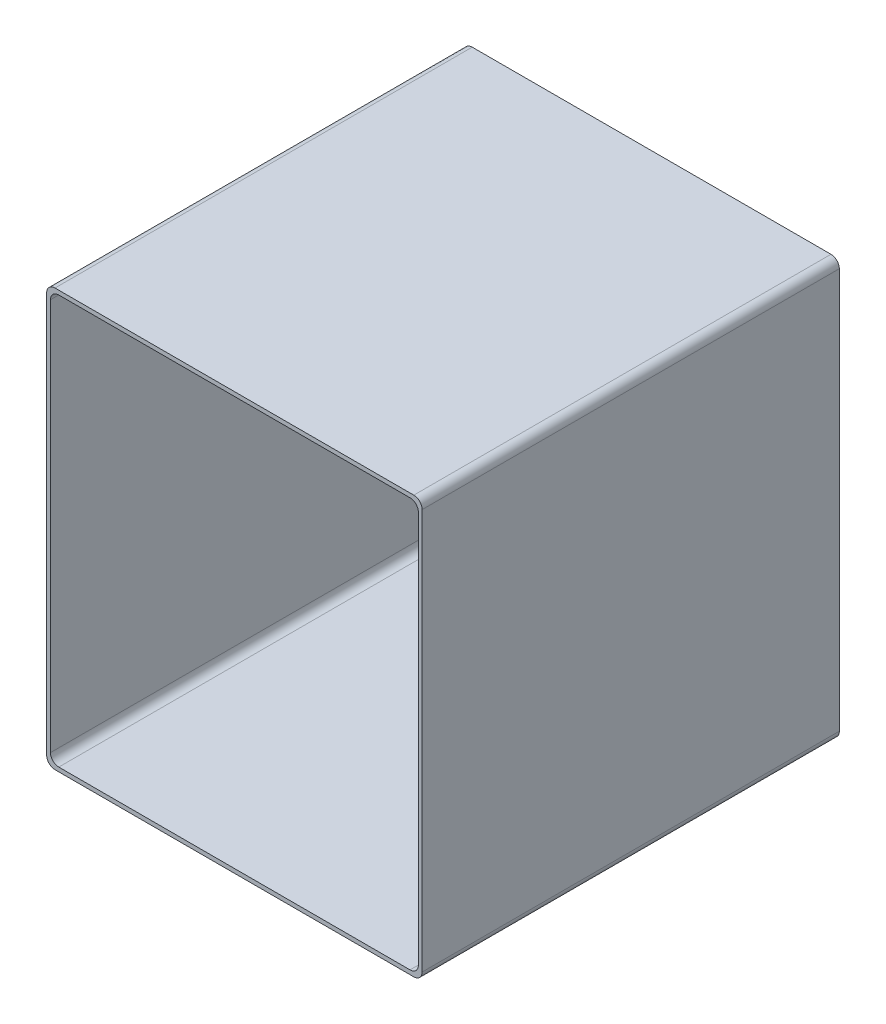
ISO-10303-21;
HEADER;
FILE_DESCRIPTION(('STEP AP214'),'2;1');
FILE_NAME('part.step','',(''),(''),'','','');
FILE_SCHEMA(('AUTOMOTIVE_DESIGN { 1 0 10303 214 1 1 1 1 }'));
ENDSEC;
DATA;
#1=APPLICATION_CONTEXT('core data for automotive mechanical design processes');
#2=APPLICATION_PROTOCOL_DEFINITION('international standard','automotive_design',2000,#1);
#3=PRODUCT_CONTEXT('',#1,'mechanical');
#4=PRODUCT('Part','Part','',(#3));
#5=PRODUCT_RELATED_PRODUCT_CATEGORY('part','',(#4));
#6=PRODUCT_DEFINITION_FORMATION('','',#4);
#7=PRODUCT_DEFINITION_CONTEXT('part definition',#1,'design');
#8=PRODUCT_DEFINITION('design','',#6,#7);
#9=PRODUCT_DEFINITION_SHAPE('','',#8);
#10=(LENGTH_UNIT() NAMED_UNIT(*) SI_UNIT(.MILLI.,.METRE.));
#11=(NAMED_UNIT(*) PLANE_ANGLE_UNIT() SI_UNIT($,.RADIAN.));
#12=(NAMED_UNIT(*) SI_UNIT($,.STERADIAN.) SOLID_ANGLE_UNIT());
#13=UNCERTAINTY_MEASURE_WITH_UNIT(LENGTH_MEASURE(1.E-05),#10,'distance_accuracy_value','');
#14=(GEOMETRIC_REPRESENTATION_CONTEXT(3) GLOBAL_UNCERTAINTY_ASSIGNED_CONTEXT((#13)) GLOBAL_UNIT_ASSIGNED_CONTEXT((#10,
#11,#12)) REPRESENTATION_CONTEXT('',''));
#15=CARTESIAN_POINT('',(0.,0.,0.));
#16=DIRECTION('',(0.,0.,1.));
#17=DIRECTION('',(1.,0.,0.));
#18=AXIS2_PLACEMENT_3D('',#15,#16,#17);
#19=CARTESIAN_POINT('',(0.,0.,500.));
#20=DIRECTION('',(0.,0.,-1.));
#21=DIRECTION('',(-1.,0.,0.));
#22=AXIS2_PLACEMENT_3D('',#19,#20,#21);
#23=PLANE('',#22);
#24=DIRECTION('',(0.,-1.,0.));
#25=VECTOR('',#24,1.);
#26=CARTESIAN_POINT('',(0.,0.,500.));
#27=LINE('',#26,#25);
#28=CARTESIAN_POINT('',(0.,490.,500.));
#29=VERTEX_POINT('',#28);
#30=CARTESIAN_POINT('',(0.,10.,500.));
#31=VERTEX_POINT('',#30);
#32=EDGE_CURVE('E266',#29,#31,#27,.T.);
#33=ORIENTED_EDGE('',*,*,#32,.T.);
#34=CARTESIAN_POINT('',(10.,10.,500.));
#35=DIRECTION('',(0.,0.,-1.));
#36=DIRECTION('',(-1.,0.,0.));
#37=AXIS2_PLACEMENT_3D('',#34,#35,#36);
#38=CIRCLE('',#37,10.);
#39=CARTESIAN_POINT('',(10.,0.,500.));
#40=VERTEX_POINT('',#39);
#41=EDGE_CURVE('E216',#31,#40,#38,.F.);
#42=ORIENTED_EDGE('',*,*,#41,.T.);
#43=DIRECTION('',(1.,0.,0.));
#44=VECTOR('',#43,1.);
#45=CARTESIAN_POINT('',(0.,0.,500.));
#46=LINE('',#45,#44);
#47=CARTESIAN_POINT('',(440.,0.,500.));
#48=VERTEX_POINT('',#47);
#49=EDGE_CURVE('E269',#40,#48,#46,.T.);
#50=ORIENTED_EDGE('',*,*,#49,.T.);
#51=CARTESIAN_POINT('',(440.,10.,500.));
#52=DIRECTION('',(0.,0.,-1.));
#53=DIRECTION('',(-1.,0.,0.));
#54=AXIS2_PLACEMENT_3D('',#51,#52,#53);
#55=CIRCLE('',#54,10.);
#56=CARTESIAN_POINT('',(450.,10.,500.));
#57=VERTEX_POINT('',#56);
#58=EDGE_CURVE('E212',#48,#57,#55,.F.);
#59=ORIENTED_EDGE('',*,*,#58,.T.);
#60=DIRECTION('',(0.,1.,0.));
#61=VECTOR('',#60,1.);
#62=CARTESIAN_POINT('',(450.,0.,500.));
#63=LINE('',#62,#61);
#64=CARTESIAN_POINT('',(450.,490.,500.));
#65=VERTEX_POINT('',#64);
#66=EDGE_CURVE('E174',#57,#65,#63,.T.);
#67=ORIENTED_EDGE('',*,*,#66,.T.);
#68=CARTESIAN_POINT('',(440.,490.,500.));
#69=DIRECTION('',(0.,0.,-1.));
#70=DIRECTION('',(-1.,0.,0.));
#71=AXIS2_PLACEMENT_3D('',#68,#69,#70);
#72=CIRCLE('',#71,10.);
#73=CARTESIAN_POINT('',(440.,500.,500.));
#74=VERTEX_POINT('',#73);
#75=EDGE_CURVE('E55',#65,#74,#72,.F.);
#76=ORIENTED_EDGE('',*,*,#75,.T.);
#77=DIRECTION('',(-1.,0.,0.));
#78=VECTOR('',#77,1.);
#79=CARTESIAN_POINT('',(0.,500.,500.));
#80=LINE('',#79,#78);
#81=CARTESIAN_POINT('',(9.99999999999995,500.,500.));
#82=VERTEX_POINT('',#81);
#83=EDGE_CURVE('E170',#74,#82,#80,.T.);
#84=ORIENTED_EDGE('',*,*,#83,.T.);
#85=CARTESIAN_POINT('',(9.99999999999995,490.,500.));
#86=DIRECTION('',(0.,0.,-1.));
#87=DIRECTION('',(-1.,0.,0.));
#88=AXIS2_PLACEMENT_3D('',#85,#86,#87);
#89=CIRCLE('',#88,10.);
#90=EDGE_CURVE('E214',#82,#29,#89,.F.);
#91=ORIENTED_EDGE('',*,*,#90,.T.);
#92=EDGE_LOOP('',(#33,#42,#50,#59,#67,#76,#84,#91));
#93=FACE_BOUND('',#92,.T.);
#94=DIRECTION('',(0.,-1.,0.));
#95=VECTOR('',#94,1.);
#96=CARTESIAN_POINT('',(4.5,5.,500.));
#97=LINE('',#96,#95);
#98=CARTESIAN_POINT('',(4.5,485.,500.));
#99=VERTEX_POINT('',#98);
#100=CARTESIAN_POINT('',(4.5,15.,500.));
#101=VERTEX_POINT('',#100);
#102=EDGE_CURVE('E245',#99,#101,#97,.T.);
#103=ORIENTED_EDGE('',*,*,#102,.F.);
#104=CARTESIAN_POINT('',(14.5,485.,500.));
#105=DIRECTION('',(0.,0.,-1.));
#106=DIRECTION('',(-1.,0.,0.));
#107=AXIS2_PLACEMENT_3D('',#104,#105,#106);
#108=CIRCLE('',#107,10.);
#109=CARTESIAN_POINT('',(14.5,495.,500.));
#110=VERTEX_POINT('',#109);
#111=EDGE_CURVE('E157',#99,#110,#108,.T.);
#112=ORIENTED_EDGE('',*,*,#111,.T.);
#113=DIRECTION('',(-1.,0.,0.));
#114=VECTOR('',#113,1.);
#115=CARTESIAN_POINT('',(4.5,495.,500.));
#116=LINE('',#115,#114);
#117=CARTESIAN_POINT('',(435.5,495.,500.));
#118=VERTEX_POINT('',#117);
#119=EDGE_CURVE('E242',#118,#110,#116,.T.);
#120=ORIENTED_EDGE('',*,*,#119,.F.);
#121=CARTESIAN_POINT('',(435.5,485.,500.));
#122=DIRECTION('',(0.,0.,-1.));
#123=DIRECTION('',(-1.,0.,0.));
#124=AXIS2_PLACEMENT_3D('',#121,#122,#123);
#125=CIRCLE('',#124,10.);
#126=CARTESIAN_POINT('',(445.5,485.,500.));
#127=VERTEX_POINT('',#126);
#128=EDGE_CURVE('E233',#118,#127,#125,.T.);
#129=ORIENTED_EDGE('',*,*,#128,.T.);
#130=DIRECTION('',(0.,1.,0.));
#131=VECTOR('',#130,1.);
#132=CARTESIAN_POINT('',(445.5,5.,500.));
#133=LINE('',#132,#131);
#134=CARTESIAN_POINT('',(445.5,15.,500.));
#135=VERTEX_POINT('',#134);
#136=EDGE_CURVE('E255',#135,#127,#133,.T.);
#137=ORIENTED_EDGE('',*,*,#136,.F.);
#138=CARTESIAN_POINT('',(435.5,15.,500.));
#139=DIRECTION('',(0.,0.,-1.));
#140=DIRECTION('',(-1.,0.,0.));
#141=AXIS2_PLACEMENT_3D('',#138,#139,#140);
#142=CIRCLE('',#141,10.);
#143=CARTESIAN_POINT('',(435.5,5.,500.));
#144=VERTEX_POINT('',#143);
#145=EDGE_CURVE('E229',#135,#144,#142,.T.);
#146=ORIENTED_EDGE('',*,*,#145,.T.);
#147=DIRECTION('',(1.,0.,0.));
#148=VECTOR('',#147,1.);
#149=CARTESIAN_POINT('',(4.5,5.,500.));
#150=LINE('',#149,#148);
#151=CARTESIAN_POINT('',(14.5,5.,500.));
#152=VERTEX_POINT('',#151);
#153=EDGE_CURVE('E465',#152,#144,#150,.T.);
#154=ORIENTED_EDGE('',*,*,#153,.F.);
#155=CARTESIAN_POINT('',(14.5,15.,500.));
#156=DIRECTION('',(0.,0.,-1.));
#157=DIRECTION('',(-1.,0.,0.));
#158=AXIS2_PLACEMENT_3D('',#155,#156,#157);
#159=CIRCLE('',#158,10.);
#160=EDGE_CURVE('E11',#152,#101,#159,.T.);
#161=ORIENTED_EDGE('',*,*,#160,.T.);
#162=EDGE_LOOP('',(#103,#112,#120,#129,#137,#146,#154,#161));
#163=FACE_BOUND('',#162,.T.);
#164=ADVANCED_FACE('F33',(#93,#163),#23,.F.);
#165=CARTESIAN_POINT('',(0.,0.,0.));
#166=DIRECTION('',(0.,0.,-1.));
#167=DIRECTION('',(-1.,0.,0.));
#168=AXIS2_PLACEMENT_3D('',#165,#166,#167);
#169=PLANE('',#168);
#170=DIRECTION('',(1.,0.,0.));
#171=VECTOR('',#170,1.);
#172=CARTESIAN_POINT('',(0.,0.,0.));
#173=LINE('',#172,#171);
#174=CARTESIAN_POINT('',(10.,0.,0.));
#175=VERTEX_POINT('',#174);
#176=CARTESIAN_POINT('',(440.,0.,0.));
#177=VERTEX_POINT('',#176);
#178=EDGE_CURVE('E275',#175,#177,#173,.T.);
#179=ORIENTED_EDGE('',*,*,#178,.F.);
#180=CARTESIAN_POINT('',(10.,10.,0.));
#181=DIRECTION('',(0.,0.,-1.));
#182=DIRECTION('',(-1.,0.,0.));
#183=AXIS2_PLACEMENT_3D('',#180,#181,#182);
#184=CIRCLE('',#183,10.);
#185=CARTESIAN_POINT('',(0.,10.,0.));
#186=VERTEX_POINT('',#185);
#187=EDGE_CURVE('E204',#175,#186,#184,.T.);
#188=ORIENTED_EDGE('',*,*,#187,.T.);
#189=DIRECTION('',(0.,-1.,0.));
#190=VECTOR('',#189,1.);
#191=CARTESIAN_POINT('',(0.,0.,0.));
#192=LINE('',#191,#190);
#193=CARTESIAN_POINT('',(0.,490.,0.));
#194=VERTEX_POINT('',#193);
#195=EDGE_CURVE('E254',#194,#186,#192,.T.);
#196=ORIENTED_EDGE('',*,*,#195,.F.);
#197=CARTESIAN_POINT('',(9.99999999999995,490.,0.));
#198=DIRECTION('',(0.,0.,-1.));
#199=DIRECTION('',(-1.,0.,0.));
#200=AXIS2_PLACEMENT_3D('',#197,#198,#199);
#201=CIRCLE('',#200,10.);
#202=CARTESIAN_POINT('',(9.99999999999995,500.,0.));
#203=VERTEX_POINT('',#202);
#204=EDGE_CURVE('E202',#194,#203,#201,.T.);
#205=ORIENTED_EDGE('',*,*,#204,.T.);
#206=DIRECTION('',(-1.,0.,0.));
#207=VECTOR('',#206,1.);
#208=CARTESIAN_POINT('',(0.,500.,0.));
#209=LINE('',#208,#207);
#210=CARTESIAN_POINT('',(440.,500.,0.));
#211=VERTEX_POINT('',#210);
#212=EDGE_CURVE('E177',#211,#203,#209,.T.);
#213=ORIENTED_EDGE('',*,*,#212,.F.);
#214=CARTESIAN_POINT('',(440.,490.,0.));
#215=DIRECTION('',(0.,0.,-1.));
#216=DIRECTION('',(-1.,0.,0.));
#217=AXIS2_PLACEMENT_3D('',#214,#215,#216);
#218=CIRCLE('',#217,10.);
#219=CARTESIAN_POINT('',(450.,490.,0.));
#220=VERTEX_POINT('',#219);
#221=EDGE_CURVE('E198',#211,#220,#218,.T.);
#222=ORIENTED_EDGE('',*,*,#221,.T.);
#223=DIRECTION('',(0.,1.,0.));
#224=VECTOR('',#223,1.);
#225=CARTESIAN_POINT('',(450.,0.,0.));
#226=LINE('',#225,#224);
#227=CARTESIAN_POINT('',(450.,10.,0.));
#228=VERTEX_POINT('',#227);
#229=EDGE_CURVE('E277',#228,#220,#226,.T.);
#230=ORIENTED_EDGE('',*,*,#229,.F.);
#231=CARTESIAN_POINT('',(440.,10.,0.));
#232=DIRECTION('',(0.,0.,-1.));
#233=DIRECTION('',(-1.,0.,0.));
#234=AXIS2_PLACEMENT_3D('',#231,#232,#233);
#235=CIRCLE('',#234,10.);
#236=EDGE_CURVE('E200',#228,#177,#235,.T.);
#237=ORIENTED_EDGE('',*,*,#236,.T.);
#238=EDGE_LOOP('',(#179,#188,#196,#205,#213,#222,#230,#237));
#239=FACE_BOUND('',#238,.T.);
#240=DIRECTION('',(0.,1.,0.));
#241=VECTOR('',#240,1.);
#242=CARTESIAN_POINT('',(445.5,5.,0.));
#243=LINE('',#242,#241);
#244=CARTESIAN_POINT('',(445.5,15.,0.));
#245=VERTEX_POINT('',#244);
#246=CARTESIAN_POINT('',(445.5,485.,0.));
#247=VERTEX_POINT('',#246);
#248=EDGE_CURVE('E166',#245,#247,#243,.T.);
#249=ORIENTED_EDGE('',*,*,#248,.T.);
#250=CARTESIAN_POINT('',(435.5,485.,0.));
#251=DIRECTION('',(0.,0.,-1.));
#252=DIRECTION('',(-1.,0.,0.));
#253=AXIS2_PLACEMENT_3D('',#250,#251,#252);
#254=CIRCLE('',#253,10.);
#255=CARTESIAN_POINT('',(435.5,495.,0.));
#256=VERTEX_POINT('',#255);
#257=EDGE_CURVE('E231',#247,#256,#254,.F.);
#258=ORIENTED_EDGE('',*,*,#257,.T.);
#259=DIRECTION('',(-1.,0.,0.));
#260=VECTOR('',#259,1.);
#261=CARTESIAN_POINT('',(4.5,495.,0.));
#262=LINE('',#261,#260);
#263=CARTESIAN_POINT('',(14.5,495.,0.));
#264=VERTEX_POINT('',#263);
#265=EDGE_CURVE('E258',#256,#264,#262,.T.);
#266=ORIENTED_EDGE('',*,*,#265,.T.);
#267=CARTESIAN_POINT('',(14.5,485.,0.));
#268=DIRECTION('',(0.,0.,-1.));
#269=DIRECTION('',(-1.,0.,0.));
#270=AXIS2_PLACEMENT_3D('',#267,#268,#269);
#271=CIRCLE('',#270,10.);
#272=CARTESIAN_POINT('',(4.5,485.,0.));
#273=VERTEX_POINT('',#272);
#274=EDGE_CURVE('E235',#264,#273,#271,.F.);
#275=ORIENTED_EDGE('',*,*,#274,.T.);
#276=DIRECTION('',(0.,-1.,0.));
#277=VECTOR('',#276,1.);
#278=CARTESIAN_POINT('',(4.5,5.,0.));
#279=LINE('',#278,#277);
#280=CARTESIAN_POINT('',(4.5,15.,0.));
#281=VERTEX_POINT('',#280);
#282=EDGE_CURVE('E152',#273,#281,#279,.T.);
#283=ORIENTED_EDGE('',*,*,#282,.T.);
#284=CARTESIAN_POINT('',(14.5,15.,0.));
#285=DIRECTION('',(0.,0.,-1.));
#286=DIRECTION('',(-1.,0.,0.));
#287=AXIS2_PLACEMENT_3D('',#284,#285,#286);
#288=CIRCLE('',#287,10.);
#289=CARTESIAN_POINT('',(14.5,5.,0.));
#290=VERTEX_POINT('',#289);
#291=EDGE_CURVE('E41',#281,#290,#288,.F.);
#292=ORIENTED_EDGE('',*,*,#291,.T.);
#293=DIRECTION('',(1.,0.,0.));
#294=VECTOR('',#293,1.);
#295=CARTESIAN_POINT('',(4.5,5.,0.));
#296=LINE('',#295,#294);
#297=CARTESIAN_POINT('',(435.5,5.,0.));
#298=VERTEX_POINT('',#297);
#299=EDGE_CURVE('E150',#290,#298,#296,.T.);
#300=ORIENTED_EDGE('',*,*,#299,.T.);
#301=CARTESIAN_POINT('',(435.5,15.,0.));
#302=DIRECTION('',(0.,0.,-1.));
#303=DIRECTION('',(-1.,0.,0.));
#304=AXIS2_PLACEMENT_3D('',#301,#302,#303);
#305=CIRCLE('',#304,10.);
#306=EDGE_CURVE('E227',#298,#245,#305,.F.);
#307=ORIENTED_EDGE('',*,*,#306,.T.);
#308=EDGE_LOOP('',(#249,#258,#266,#275,#283,#292,#300,#307));
#309=FACE_BOUND('',#308,.T.);
#310=ADVANCED_FACE('F149',(#239,#309),#169,.T.);
#311=CARTESIAN_POINT('',(0.,0.,500.));
#312=DIRECTION('',(1.,0.,0.));
#313=DIRECTION('',(0.,1.,0.));
#314=AXIS2_PLACEMENT_3D('',#311,#312,#313);
#315=PLANE('',#314);
#316=ORIENTED_EDGE('',*,*,#195,.T.);
#317=DIRECTION('',(0.,0.,-1.));
#318=VECTOR('',#317,1.);
#319=CARTESIAN_POINT('',(0.,10.,500.));
#320=LINE('',#319,#318);
#321=EDGE_CURVE('E209',#186,#31,#320,.F.);
#322=ORIENTED_EDGE('',*,*,#321,.T.);
#323=ORIENTED_EDGE('',*,*,#32,.F.);
#324=DIRECTION('',(0.,0.,-1.));
#325=VECTOR('',#324,1.);
#326=CARTESIAN_POINT('',(0.,490.,500.));
#327=LINE('',#326,#325);
#328=EDGE_CURVE('E206',#29,#194,#327,.T.);
#329=ORIENTED_EDGE('',*,*,#328,.T.);
#330=EDGE_LOOP('',(#316,#322,#323,#329));
#331=FACE_BOUND('',#330,.T.);
#332=ADVANCED_FACE('F293',(#331),#315,.F.);
#333=CARTESIAN_POINT('',(0.,0.,500.));
#334=DIRECTION('',(0.,1.,0.));
#335=DIRECTION('',(0.,0.,1.));
#336=AXIS2_PLACEMENT_3D('',#333,#334,#335);
#337=PLANE('',#336);
#338=ORIENTED_EDGE('',*,*,#49,.F.);
#339=DIRECTION('',(0.,0.,-1.));
#340=VECTOR('',#339,1.);
#341=CARTESIAN_POINT('',(10.,0.,500.));
#342=LINE('',#341,#340);
#343=EDGE_CURVE('E195',#40,#175,#342,.T.);
#344=ORIENTED_EDGE('',*,*,#343,.T.);
#345=ORIENTED_EDGE('',*,*,#178,.T.);
#346=DIRECTION('',(0.,0.,-1.));
#347=VECTOR('',#346,1.);
#348=CARTESIAN_POINT('',(440.,0.,500.));
#349=LINE('',#348,#347);
#350=EDGE_CURVE('E193',#177,#48,#349,.F.);
#351=ORIENTED_EDGE('',*,*,#350,.T.);
#352=EDGE_LOOP('',(#338,#344,#345,#351));
#353=FACE_BOUND('',#352,.T.);
#354=ADVANCED_FACE('F302',(#353),#337,.F.);
#355=CARTESIAN_POINT('',(450.,0.,500.));
#356=DIRECTION('',(-1.,0.,0.));
#357=DIRECTION('',(0.,-1.,0.));
#358=AXIS2_PLACEMENT_3D('',#355,#356,#357);
#359=PLANE('',#358);
#360=ORIENTED_EDGE('',*,*,#66,.F.);
#361=DIRECTION('',(0.,0.,-1.));
#362=VECTOR('',#361,1.);
#363=CARTESIAN_POINT('',(450.,10.,500.));
#364=LINE('',#363,#362);
#365=EDGE_CURVE('E224',#57,#228,#364,.T.);
#366=ORIENTED_EDGE('',*,*,#365,.T.);
#367=ORIENTED_EDGE('',*,*,#229,.T.);
#368=DIRECTION('',(0.,0.,-1.));
#369=VECTOR('',#368,1.);
#370=CARTESIAN_POINT('',(450.,490.,500.));
#371=LINE('',#370,#369);
#372=EDGE_CURVE('E222',#220,#65,#371,.F.);
#373=ORIENTED_EDGE('',*,*,#372,.T.);
#374=EDGE_LOOP('',(#360,#366,#367,#373));
#375=FACE_BOUND('',#374,.T.);
#376=ADVANCED_FACE('F309',(#375),#359,.F.);
#377=CARTESIAN_POINT('',(0.,500.,500.));
#378=DIRECTION('',(0.,-1.,0.));
#379=DIRECTION('',(0.,0.,-1.));
#380=AXIS2_PLACEMENT_3D('',#377,#378,#379);
#381=PLANE('',#380);
#382=ORIENTED_EDGE('',*,*,#212,.T.);
#383=DIRECTION('',(0.,0.,-1.));
#384=VECTOR('',#383,1.);
#385=CARTESIAN_POINT('',(9.99999999999995,500.,500.));
#386=LINE('',#385,#384);
#387=EDGE_CURVE('E48',#203,#82,#386,.F.);
#388=ORIENTED_EDGE('',*,*,#387,.T.);
#389=ORIENTED_EDGE('',*,*,#83,.F.);
#390=DIRECTION('',(0.,0.,-1.));
#391=VECTOR('',#390,1.);
#392=CARTESIAN_POINT('',(440.,500.,500.));
#393=LINE('',#392,#391);
#394=EDGE_CURVE('E218',#74,#211,#393,.T.);
#395=ORIENTED_EDGE('',*,*,#394,.T.);
#396=EDGE_LOOP('',(#382,#388,#389,#395));
#397=FACE_BOUND('',#396,.T.);
#398=ADVANCED_FACE('F283',(#397),#381,.F.);
#399=CARTESIAN_POINT('',(4.5,5.,500.));
#400=DIRECTION('',(1.,0.,0.));
#401=DIRECTION('',(0.,0.,-1.));
#402=AXIS2_PLACEMENT_3D('',#399,#400,#401);
#403=PLANE('',#402);
#404=ORIENTED_EDGE('',*,*,#282,.F.);
#405=DIRECTION('',(0.,0.,-1.));
#406=VECTOR('',#405,1.);
#407=CARTESIAN_POINT('',(4.5,485.,500.));
#408=LINE('',#407,#406);
#409=EDGE_CURVE('E191',#273,#99,#408,.F.);
#410=ORIENTED_EDGE('',*,*,#409,.T.);
#411=ORIENTED_EDGE('',*,*,#102,.T.);
#412=DIRECTION('',(0.,0.,-1.));
#413=VECTOR('',#412,1.);
#414=CARTESIAN_POINT('',(4.5,15.,0.));
#415=LINE('',#414,#413);
#416=EDGE_CURVE('E189',#101,#281,#415,.T.);
#417=ORIENTED_EDGE('',*,*,#416,.T.);
#418=EDGE_LOOP('',(#404,#410,#411,#417));
#419=FACE_BOUND('',#418,.T.);
#420=ADVANCED_FACE('F260',(#419),#403,.T.);
#421=CARTESIAN_POINT('',(4.5,5.,500.));
#422=DIRECTION('',(0.,1.,0.));
#423=DIRECTION('',(-1.,0.,0.));
#424=AXIS2_PLACEMENT_3D('',#421,#422,#423);
#425=PLANE('',#424);
#426=ORIENTED_EDGE('',*,*,#153,.T.);
#427=DIRECTION('',(0.,0.,-1.));
#428=VECTOR('',#427,1.);
#429=CARTESIAN_POINT('',(435.5,5.,0.));
#430=LINE('',#429,#428);
#431=EDGE_CURVE('E165',#144,#298,#430,.T.);
#432=ORIENTED_EDGE('',*,*,#431,.T.);
#433=ORIENTED_EDGE('',*,*,#299,.F.);
#434=DIRECTION('',(0.,0.,-1.));
#435=VECTOR('',#434,1.);
#436=CARTESIAN_POINT('',(14.5,5.,500.));
#437=LINE('',#436,#435);
#438=EDGE_CURVE('E162',#290,#152,#437,.F.);
#439=ORIENTED_EDGE('',*,*,#438,.T.);
#440=EDGE_LOOP('',(#426,#432,#433,#439));
#441=FACE_BOUND('',#440,.T.);
#442=ADVANCED_FACE('F161',(#441),#425,.T.);
#443=CARTESIAN_POINT('',(445.5,5.,500.));
#444=DIRECTION('',(-1.,0.,0.));
#445=DIRECTION('',(0.,0.,1.));
#446=AXIS2_PLACEMENT_3D('',#443,#444,#445);
#447=PLANE('',#446);
#448=ORIENTED_EDGE('',*,*,#248,.F.);
#449=DIRECTION('',(0.,0.,-1.));
#450=VECTOR('',#449,1.);
#451=CARTESIAN_POINT('',(445.5,15.,500.));
#452=LINE('',#451,#450);
#453=EDGE_CURVE('E182',#245,#135,#452,.F.);
#454=ORIENTED_EDGE('',*,*,#453,.T.);
#455=ORIENTED_EDGE('',*,*,#136,.T.);
#456=DIRECTION('',(0.,0.,-1.));
#457=VECTOR('',#456,1.);
#458=CARTESIAN_POINT('',(445.5,485.,0.));
#459=LINE('',#458,#457);
#460=EDGE_CURVE('E172',#127,#247,#459,.T.);
#461=ORIENTED_EDGE('',*,*,#460,.T.);
#462=EDGE_LOOP('',(#448,#454,#455,#461));
#463=FACE_BOUND('',#462,.T.);
#464=ADVANCED_FACE('F397',(#463),#447,.T.);
#465=CARTESIAN_POINT('',(4.5,495.,500.));
#466=DIRECTION('',(0.,-1.,0.));
#467=DIRECTION('',(0.,0.,-1.));
#468=AXIS2_PLACEMENT_3D('',#465,#466,#467);
#469=PLANE('',#468);
#470=ORIENTED_EDGE('',*,*,#265,.F.);
#471=DIRECTION('',(0.,0.,-1.));
#472=VECTOR('',#471,1.);
#473=CARTESIAN_POINT('',(435.5,495.,500.));
#474=LINE('',#473,#472);
#475=EDGE_CURVE('E187',#256,#118,#474,.F.);
#476=ORIENTED_EDGE('',*,*,#475,.T.);
#477=ORIENTED_EDGE('',*,*,#119,.T.);
#478=DIRECTION('',(0.,0.,-1.));
#479=VECTOR('',#478,1.);
#480=CARTESIAN_POINT('',(14.5,495.,0.));
#481=LINE('',#480,#479);
#482=EDGE_CURVE('E184',#110,#264,#481,.T.);
#483=ORIENTED_EDGE('',*,*,#482,.T.);
#484=EDGE_LOOP('',(#470,#476,#477,#483));
#485=FACE_BOUND('',#484,.T.);
#486=ADVANCED_FACE('F251',(#485),#469,.T.);
#487=CARTESIAN_POINT('',(435.5,15.,500.));
#488=DIRECTION('',(0.,0.,1.));
#489=DIRECTION('',(1.,0.,0.));
#490=AXIS2_PLACEMENT_3D('',#487,#488,#489);
#491=CYLINDRICAL_SURFACE('',#490,10.);
#492=ORIENTED_EDGE('',*,*,#145,.F.);
#493=ORIENTED_EDGE('',*,*,#453,.F.);
#494=ORIENTED_EDGE('',*,*,#306,.F.);
#495=ORIENTED_EDGE('',*,*,#431,.F.);
#496=EDGE_LOOP('',(#492,#493,#494,#495));
#497=FACE_BOUND('',#496,.T.);
#498=ADVANCED_FACE('F327',(#497),#491,.F.);
#499=CARTESIAN_POINT('',(435.5,485.,500.));
#500=DIRECTION('',(0.,0.,1.));
#501=DIRECTION('',(1.,0.,0.));
#502=AXIS2_PLACEMENT_3D('',#499,#500,#501);
#503=CYLINDRICAL_SURFACE('',#502,10.);
#504=ORIENTED_EDGE('',*,*,#128,.F.);
#505=ORIENTED_EDGE('',*,*,#475,.F.);
#506=ORIENTED_EDGE('',*,*,#257,.F.);
#507=ORIENTED_EDGE('',*,*,#460,.F.);
#508=EDGE_LOOP('',(#504,#505,#506,#507));
#509=FACE_BOUND('',#508,.T.);
#510=ADVANCED_FACE('F330',(#509),#503,.F.);
#511=CARTESIAN_POINT('',(14.5,485.,500.));
#512=DIRECTION('',(0.,0.,1.));
#513=DIRECTION('',(1.,0.,0.));
#514=AXIS2_PLACEMENT_3D('',#511,#512,#513);
#515=CYLINDRICAL_SURFACE('',#514,10.);
#516=ORIENTED_EDGE('',*,*,#111,.F.);
#517=ORIENTED_EDGE('',*,*,#409,.F.);
#518=ORIENTED_EDGE('',*,*,#274,.F.);
#519=ORIENTED_EDGE('',*,*,#482,.F.);
#520=EDGE_LOOP('',(#516,#517,#518,#519));
#521=FACE_BOUND('',#520,.T.);
#522=ADVANCED_FACE('F257',(#521),#515,.F.);
#523=CARTESIAN_POINT('',(14.5,15.,500.));
#524=DIRECTION('',(0.,0.,1.));
#525=DIRECTION('',(1.,0.,0.));
#526=AXIS2_PLACEMENT_3D('',#523,#524,#525);
#527=CYLINDRICAL_SURFACE('',#526,10.);
#528=ORIENTED_EDGE('',*,*,#160,.F.);
#529=ORIENTED_EDGE('',*,*,#438,.F.);
#530=ORIENTED_EDGE('',*,*,#291,.F.);
#531=ORIENTED_EDGE('',*,*,#416,.F.);
#532=EDGE_LOOP('',(#528,#529,#530,#531));
#533=FACE_BOUND('',#532,.T.);
#534=ADVANCED_FACE('F169',(#533),#527,.F.);
#535=CARTESIAN_POINT('',(10.,10.,500.));
#536=DIRECTION('',(0.,0.,-1.));
#537=DIRECTION('',(-1.,0.,0.));
#538=AXIS2_PLACEMENT_3D('',#535,#536,#537);
#539=CYLINDRICAL_SURFACE('',#538,10.);
#540=ORIENTED_EDGE('',*,*,#41,.F.);
#541=ORIENTED_EDGE('',*,*,#321,.F.);
#542=ORIENTED_EDGE('',*,*,#187,.F.);
#543=ORIENTED_EDGE('',*,*,#343,.F.);
#544=EDGE_LOOP('',(#540,#541,#542,#543));
#545=FACE_BOUND('',#544,.T.);
#546=ADVANCED_FACE('F297',(#545),#539,.T.);
#547=CARTESIAN_POINT('',(9.99999999999995,490.,500.));
#548=DIRECTION('',(0.,0.,-1.));
#549=DIRECTION('',(-1.,0.,0.));
#550=AXIS2_PLACEMENT_3D('',#547,#548,#549);
#551=CYLINDRICAL_SURFACE('',#550,10.);
#552=ORIENTED_EDGE('',*,*,#90,.F.);
#553=ORIENTED_EDGE('',*,*,#387,.F.);
#554=ORIENTED_EDGE('',*,*,#204,.F.);
#555=ORIENTED_EDGE('',*,*,#328,.F.);
#556=EDGE_LOOP('',(#552,#553,#554,#555));
#557=FACE_BOUND('',#556,.T.);
#558=ADVANCED_FACE('F288',(#557),#551,.T.);
#559=CARTESIAN_POINT('',(440.,10.,500.));
#560=DIRECTION('',(0.,0.,-1.));
#561=DIRECTION('',(-1.,0.,0.));
#562=AXIS2_PLACEMENT_3D('',#559,#560,#561);
#563=CYLINDRICAL_SURFACE('',#562,10.);
#564=ORIENTED_EDGE('',*,*,#58,.F.);
#565=ORIENTED_EDGE('',*,*,#350,.F.);
#566=ORIENTED_EDGE('',*,*,#236,.F.);
#567=ORIENTED_EDGE('',*,*,#365,.F.);
#568=EDGE_LOOP('',(#564,#565,#566,#567));
#569=FACE_BOUND('',#568,.T.);
#570=ADVANCED_FACE('F306',(#569),#563,.T.);
#571=CARTESIAN_POINT('',(440.,490.,500.));
#572=DIRECTION('',(0.,0.,-1.));
#573=DIRECTION('',(-1.,0.,0.));
#574=AXIS2_PLACEMENT_3D('',#571,#572,#573);
#575=CYLINDRICAL_SURFACE('',#574,10.);
#576=ORIENTED_EDGE('',*,*,#75,.F.);
#577=ORIENTED_EDGE('',*,*,#372,.F.);
#578=ORIENTED_EDGE('',*,*,#221,.F.);
#579=ORIENTED_EDGE('',*,*,#394,.F.);
#580=EDGE_LOOP('',(#576,#577,#578,#579));
#581=FACE_BOUND('',#580,.T.);
#582=ADVANCED_FACE('F35',(#581),#575,.T.);
#583=CLOSED_SHELL('',(#164,#310,#332,#354,#376,#398,#420,#442,#464,#486,#498,#510,#522,#534,
#546,#558,#570,#582));
#584=MANIFOLD_SOLID_BREP('B2',#583);
#585=ADVANCED_BREP_SHAPE_REPRESENTATION('',(#18,#584),#14);
#586=SHAPE_DEFINITION_REPRESENTATION(#9,#585);
ENDSEC;
END-ISO-10303-21;
